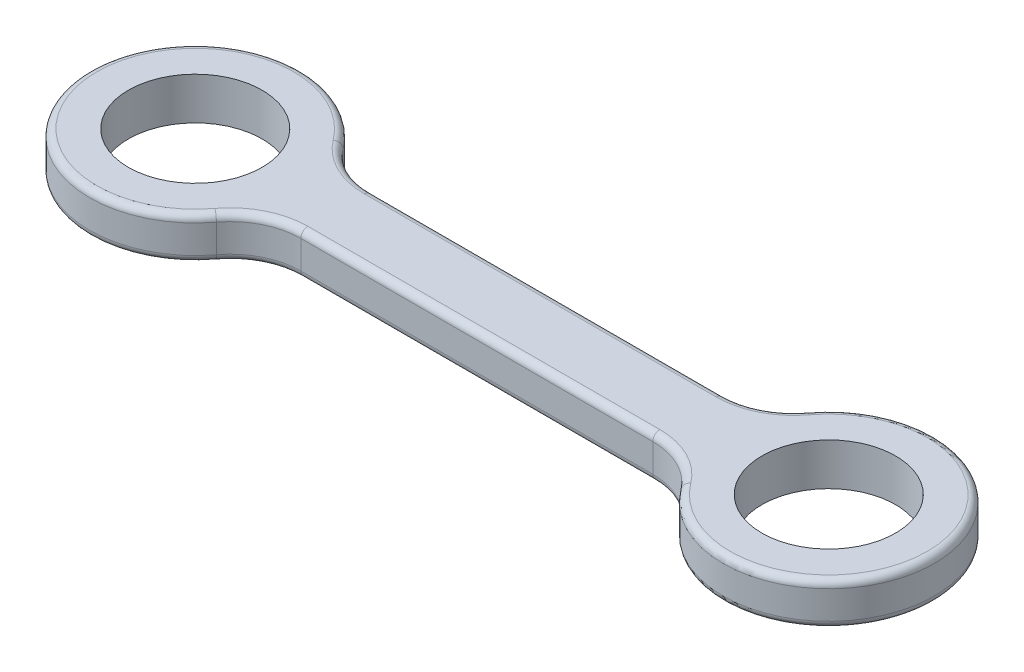
ISO-10303-21;
HEADER;
FILE_DESCRIPTION(('STEP AP214'),'2;1');
FILE_NAME('part.step','',(''),(''),'','','');
FILE_SCHEMA(('AUTOMOTIVE_DESIGN { 1 0 10303 214 1 1 1 1 }'));
ENDSEC;
DATA;
#1=APPLICATION_CONTEXT('core data for automotive mechanical design processes');
#2=APPLICATION_PROTOCOL_DEFINITION('international standard','automotive_design',2000,#1);
#3=PRODUCT_CONTEXT('',#1,'mechanical');
#4=PRODUCT('Part','Part','',(#3));
#5=PRODUCT_RELATED_PRODUCT_CATEGORY('part','',(#4));
#6=PRODUCT_DEFINITION_FORMATION('','',#4);
#7=PRODUCT_DEFINITION_CONTEXT('part definition',#1,'design');
#8=PRODUCT_DEFINITION('design','',#6,#7);
#9=PRODUCT_DEFINITION_SHAPE('','',#8);
#10=(LENGTH_UNIT() NAMED_UNIT(*) SI_UNIT(.MILLI.,.METRE.));
#11=(NAMED_UNIT(*) PLANE_ANGLE_UNIT() SI_UNIT($,.RADIAN.));
#12=(NAMED_UNIT(*) SI_UNIT($,.STERADIAN.) SOLID_ANGLE_UNIT());
#13=UNCERTAINTY_MEASURE_WITH_UNIT(LENGTH_MEASURE(1.E-05),#10,'distance_accuracy_value','');
#14=(GEOMETRIC_REPRESENTATION_CONTEXT(3) GLOBAL_UNCERTAINTY_ASSIGNED_CONTEXT((#13)) GLOBAL_UNIT_ASSIGNED_CONTEXT((#10,
#11,#12)) REPRESENTATION_CONTEXT('',''));
#15=CARTESIAN_POINT('',(0.,0.,0.));
#16=DIRECTION('',(0.,0.,1.));
#17=DIRECTION('',(1.,0.,0.));
#18=AXIS2_PLACEMENT_3D('',#15,#16,#17);
#19=CARTESIAN_POINT('',(21.9540229885058,6.,-15.));
#20=DIRECTION('',(0.,-1.,0.));
#21=DIRECTION('',(0.,0.,-1.));
#22=AXIS2_PLACEMENT_3D('',#19,#20,#21);
#23=PLANE('',#22);
#24=CARTESIAN_POINT('',(-48.0459770114942,6.,0.));
#25=DIRECTION('',(0.,-1.,0.));
#26=DIRECTION('',(0.,0.,-1.));
#27=AXIS2_PLACEMENT_3D('',#24,#25,#26);
#28=CIRCLE('',#27,14.);
#29=CARTESIAN_POINT('',(-36.8459770114942,6.,-8.4));
#30=VERTEX_POINT('',#29);
#31=CARTESIAN_POINT('',(-36.8459770114942,6.,8.4));
#32=VERTEX_POINT('',#31);
#33=EDGE_CURVE('E61',#30,#32,#28,.F.);
#34=ORIENTED_EDGE('',*,*,#33,.T.);
#35=CARTESIAN_POINT('',(-28.0459770114942,6.,15.));
#36=DIRECTION('',(0.,-1.,0.));
#37=DIRECTION('',(0.,0.,-1.));
#38=AXIS2_PLACEMENT_3D('',#35,#36,#37);
#39=CIRCLE('',#38,11.);
#40=CARTESIAN_POINT('',(-28.0459770114942,6.,4.));
#41=VERTEX_POINT('',#40);
#42=EDGE_CURVE('E163',#32,#41,#39,.T.);
#43=ORIENTED_EDGE('',*,*,#42,.T.);
#44=DIRECTION('',(1.,0.,0.));
#45=VECTOR('',#44,1.);
#46=CARTESIAN_POINT('',(21.9540229885058,6.,4.));
#47=LINE('',#46,#45);
#48=CARTESIAN_POINT('',(21.9540229885058,6.,4.));
#49=VERTEX_POINT('',#48);
#50=EDGE_CURVE('E273',#41,#49,#47,.T.);
#51=ORIENTED_EDGE('',*,*,#50,.T.);
#52=CARTESIAN_POINT('',(21.9540229885058,6.,15.));
#53=DIRECTION('',(0.,-1.,0.));
#54=DIRECTION('',(0.,0.,-1.));
#55=AXIS2_PLACEMENT_3D('',#52,#53,#54);
#56=CIRCLE('',#55,11.);
#57=CARTESIAN_POINT('',(30.7540229885058,6.,8.4));
#58=VERTEX_POINT('',#57);
#59=EDGE_CURVE('E276',#49,#58,#56,.T.);
#60=ORIENTED_EDGE('',*,*,#59,.T.);
#61=CARTESIAN_POINT('',(41.9540229885058,6.,0.));
#62=DIRECTION('',(0.,-1.,0.));
#63=DIRECTION('',(0.,0.,-1.));
#64=AXIS2_PLACEMENT_3D('',#61,#62,#63);
#65=CIRCLE('',#64,14.);
#66=CARTESIAN_POINT('',(30.7540229885058,6.,-8.4));
#67=VERTEX_POINT('',#66);
#68=EDGE_CURVE('E279',#58,#67,#65,.F.);
#69=ORIENTED_EDGE('',*,*,#68,.T.);
#70=CARTESIAN_POINT('',(21.9540229885058,6.,-15.));
#71=DIRECTION('',(0.,-1.,0.));
#72=DIRECTION('',(0.,0.,-1.));
#73=AXIS2_PLACEMENT_3D('',#70,#71,#72);
#74=CIRCLE('',#73,11.);
#75=CARTESIAN_POINT('',(21.9540229885058,6.,-4.));
#76=VERTEX_POINT('',#75);
#77=EDGE_CURVE('E282',#67,#76,#74,.T.);
#78=ORIENTED_EDGE('',*,*,#77,.T.);
#79=DIRECTION('',(-1.,0.,0.));
#80=VECTOR('',#79,1.);
#81=CARTESIAN_POINT('',(21.9540229885058,6.,-4.));
#82=LINE('',#81,#80);
#83=CARTESIAN_POINT('',(-28.0459770114942,6.,-4.));
#84=VERTEX_POINT('',#83);
#85=EDGE_CURVE('E285',#76,#84,#82,.T.);
#86=ORIENTED_EDGE('',*,*,#85,.T.);
#87=CARTESIAN_POINT('',(-28.0459770114942,6.,-15.));
#88=DIRECTION('',(0.,-1.,0.));
#89=DIRECTION('',(0.,0.,-1.));
#90=AXIS2_PLACEMENT_3D('',#87,#88,#89);
#91=CIRCLE('',#90,11.);
#92=EDGE_CURVE('E66',#84,#30,#91,.T.);
#93=ORIENTED_EDGE('',*,*,#92,.T.);
#94=EDGE_LOOP('',(#34,#43,#51,#60,#69,#78,#86,#93));
#95=FACE_BOUND('',#94,.T.);
#96=CARTESIAN_POINT('',(-48.0459770114942,6.,0.));
#97=DIRECTION('',(0.,1.,0.));
#98=DIRECTION('',(0.,0.,1.));
#99=AXIS2_PLACEMENT_3D('',#96,#97,#98);
#100=CIRCLE('',#99,9.5);
#101=CARTESIAN_POINT('',(-48.0459770114942,6.,9.5));
#102=VERTEX_POINT('',#101);
#103=EDGE_CURVE('E377',#102,#102,#100,.T.);
#104=ORIENTED_EDGE('',*,*,#103,.F.);
#105=EDGE_LOOP('',(#104));
#106=FACE_BOUND('',#105,.T.);
#107=CARTESIAN_POINT('',(41.9540229885058,6.,0.));
#108=DIRECTION('',(0.,1.,0.));
#109=DIRECTION('',(0.,0.,1.));
#110=AXIS2_PLACEMENT_3D('',#107,#108,#109);
#111=CIRCLE('',#110,9.49999999999999);
#112=CARTESIAN_POINT('',(41.9540229885058,6.,9.49999999999999));
#113=VERTEX_POINT('',#112);
#114=EDGE_CURVE('E457',#113,#113,#111,.T.);
#115=ORIENTED_EDGE('',*,*,#114,.F.);
#116=EDGE_LOOP('',(#115));
#117=FACE_BOUND('',#116,.T.);
#118=ADVANCED_FACE('F43',(#95,#106,#117),#23,.F.);
#119=CARTESIAN_POINT('',(21.9540229885058,0.,-15.));
#120=DIRECTION('',(0.,-1.,0.));
#121=DIRECTION('',(0.,0.,-1.));
#122=AXIS2_PLACEMENT_3D('',#119,#120,#121);
#123=PLANE('',#122);
#124=CARTESIAN_POINT('',(-28.0459770114942,0.,15.));
#125=DIRECTION('',(0.,-1.,0.));
#126=DIRECTION('',(0.,0.,-1.));
#127=AXIS2_PLACEMENT_3D('',#124,#125,#126);
#128=CIRCLE('',#127,11.);
#129=CARTESIAN_POINT('',(-28.0459770114942,0.,4.));
#130=VERTEX_POINT('',#129);
#131=CARTESIAN_POINT('',(-36.8459770114942,0.,8.4));
#132=VERTEX_POINT('',#131);
#133=EDGE_CURVE('E212',#130,#132,#128,.F.);
#134=ORIENTED_EDGE('',*,*,#133,.T.);
#135=CARTESIAN_POINT('',(-48.0459770114942,0.,0.));
#136=DIRECTION('',(0.,-1.,0.));
#137=DIRECTION('',(0.,0.,-1.));
#138=AXIS2_PLACEMENT_3D('',#135,#136,#137);
#139=CIRCLE('',#138,14.);
#140=CARTESIAN_POINT('',(-36.8459770114942,0.,-8.39999999999999));
#141=VERTEX_POINT('',#140);
#142=EDGE_CURVE('E233',#132,#141,#139,.T.);
#143=ORIENTED_EDGE('',*,*,#142,.T.);
#144=CARTESIAN_POINT('',(-28.0459770114942,0.,-15.));
#145=DIRECTION('',(0.,-1.,0.));
#146=DIRECTION('',(0.,0.,-1.));
#147=AXIS2_PLACEMENT_3D('',#144,#145,#146);
#148=CIRCLE('',#147,11.);
#149=CARTESIAN_POINT('',(-28.0459770114942,0.,-4.));
#150=VERTEX_POINT('',#149);
#151=EDGE_CURVE('E230',#141,#150,#148,.F.);
#152=ORIENTED_EDGE('',*,*,#151,.T.);
#153=DIRECTION('',(-1.,0.,0.));
#154=VECTOR('',#153,1.);
#155=CARTESIAN_POINT('',(21.9540229885057,0.,-4.));
#156=LINE('',#155,#154);
#157=CARTESIAN_POINT('',(21.9540229885058,0.,-4.));
#158=VERTEX_POINT('',#157);
#159=EDGE_CURVE('E227',#150,#158,#156,.F.);
#160=ORIENTED_EDGE('',*,*,#159,.T.);
#161=CARTESIAN_POINT('',(21.9540229885058,0.,-15.));
#162=DIRECTION('',(0.,-1.,0.));
#163=DIRECTION('',(0.,0.,-1.));
#164=AXIS2_PLACEMENT_3D('',#161,#162,#163);
#165=CIRCLE('',#164,11.);
#166=CARTESIAN_POINT('',(30.7540229885058,0.,-8.4));
#167=VERTEX_POINT('',#166);
#168=EDGE_CURVE('E224',#158,#167,#165,.F.);
#169=ORIENTED_EDGE('',*,*,#168,.T.);
#170=CARTESIAN_POINT('',(41.9540229885058,0.,0.));
#171=DIRECTION('',(0.,-1.,0.));
#172=DIRECTION('',(0.,0.,-1.));
#173=AXIS2_PLACEMENT_3D('',#170,#171,#172);
#174=CIRCLE('',#173,14.);
#175=CARTESIAN_POINT('',(30.7540229885058,0.,8.4));
#176=VERTEX_POINT('',#175);
#177=EDGE_CURVE('E221',#167,#176,#174,.T.);
#178=ORIENTED_EDGE('',*,*,#177,.T.);
#179=CARTESIAN_POINT('',(21.9540229885058,0.,15.));
#180=DIRECTION('',(0.,-1.,0.));
#181=DIRECTION('',(0.,0.,-1.));
#182=AXIS2_PLACEMENT_3D('',#179,#180,#181);
#183=CIRCLE('',#182,11.);
#184=CARTESIAN_POINT('',(21.9540229885058,0.,4.));
#185=VERTEX_POINT('',#184);
#186=EDGE_CURVE('E218',#176,#185,#183,.F.);
#187=ORIENTED_EDGE('',*,*,#186,.T.);
#188=DIRECTION('',(1.,0.,0.));
#189=VECTOR('',#188,1.);
#190=CARTESIAN_POINT('',(-28.0459770114942,0.,4.));
#191=LINE('',#190,#189);
#192=EDGE_CURVE('E215',#185,#130,#191,.F.);
#193=ORIENTED_EDGE('',*,*,#192,.T.);
#194=EDGE_LOOP('',(#134,#143,#152,#160,#169,#178,#187,#193));
#195=FACE_BOUND('',#194,.T.);
#196=CARTESIAN_POINT('',(-48.0459770114942,0.,0.));
#197=DIRECTION('',(0.,1.,0.));
#198=DIRECTION('',(0.,0.,1.));
#199=AXIS2_PLACEMENT_3D('',#196,#197,#198);
#200=CIRCLE('',#199,9.5);
#201=CARTESIAN_POINT('',(-48.0459770114942,0.,9.5));
#202=VERTEX_POINT('',#201);
#203=EDGE_CURVE('E385',#202,#202,#200,.T.);
#204=ORIENTED_EDGE('',*,*,#203,.T.);
#205=EDGE_LOOP('',(#204));
#206=FACE_BOUND('',#205,.T.);
#207=CARTESIAN_POINT('',(41.9540229885058,0.,0.));
#208=DIRECTION('',(0.,1.,0.));
#209=DIRECTION('',(0.,0.,1.));
#210=AXIS2_PLACEMENT_3D('',#207,#208,#209);
#211=CIRCLE('',#210,9.49999999999999);
#212=CARTESIAN_POINT('',(41.9540229885058,0.,9.49999999999999));
#213=VERTEX_POINT('',#212);
#214=EDGE_CURVE('E326',#213,#213,#211,.T.);
#215=ORIENTED_EDGE('',*,*,#214,.T.);
#216=EDGE_LOOP('',(#215));
#217=FACE_BOUND('',#216,.T.);
#218=ADVANCED_FACE('F411',(#195,#206,#217),#123,.T.);
#219=CARTESIAN_POINT('',(21.9540229885058,6.,-15.));
#220=DIRECTION('',(0.,-1.,0.));
#221=DIRECTION('',(0.,0.,-1.));
#222=AXIS2_PLACEMENT_3D('',#219,#220,#221);
#223=CYLINDRICAL_SURFACE('',#222,10.);
#224=DIRECTION('',(0.,-1.,0.));
#225=VECTOR('',#224,1.);
#226=CARTESIAN_POINT('',(29.9540229885058,6.,-9.));
#227=LINE('',#226,#225);
#228=CARTESIAN_POINT('',(29.9540229885058,5.,-9.));
#229=VERTEX_POINT('',#228);
#230=CARTESIAN_POINT('',(29.9540229885058,1.,-9.));
#231=VERTEX_POINT('',#230);
#232=EDGE_CURVE('E368',#229,#231,#227,.T.);
#233=ORIENTED_EDGE('',*,*,#232,.T.);
#234=CARTESIAN_POINT('',(21.9540229885058,1.,-15.));
#235=DIRECTION('',(0.,-1.,0.));
#236=DIRECTION('',(0.,0.,-1.));
#237=AXIS2_PLACEMENT_3D('',#234,#235,#236);
#238=CIRCLE('',#237,10.);
#239=CARTESIAN_POINT('',(21.9540229885058,1.,-5.));
#240=VERTEX_POINT('',#239);
#241=EDGE_CURVE('E252',#231,#240,#238,.T.);
#242=ORIENTED_EDGE('',*,*,#241,.T.);
#243=DIRECTION('',(0.,-1.,0.));
#244=VECTOR('',#243,1.);
#245=CARTESIAN_POINT('',(21.9540229885058,6.,-5.));
#246=LINE('',#245,#244);
#247=CARTESIAN_POINT('',(21.9540229885058,5.,-5.));
#248=VERTEX_POINT('',#247);
#249=EDGE_CURVE('E179',#248,#240,#246,.T.);
#250=ORIENTED_EDGE('',*,*,#249,.F.);
#251=CARTESIAN_POINT('',(21.9540229885058,5.,-15.));
#252=DIRECTION('',(0.,-1.,0.));
#253=DIRECTION('',(0.,0.,-1.));
#254=AXIS2_PLACEMENT_3D('',#251,#252,#253);
#255=CIRCLE('',#254,10.);
#256=EDGE_CURVE('E249',#248,#229,#255,.F.);
#257=ORIENTED_EDGE('',*,*,#256,.T.);
#258=EDGE_LOOP('',(#233,#242,#250,#257));
#259=FACE_BOUND('',#258,.T.);
#260=ADVANCED_FACE('F367',(#259),#223,.F.);
#261=CARTESIAN_POINT('',(-28.0459770114942,6.,-5.));
#262=DIRECTION('',(0.,0.,1.));
#263=DIRECTION('',(1.,0.,0.));
#264=AXIS2_PLACEMENT_3D('',#261,#262,#263);
#265=PLANE('',#264);
#266=ORIENTED_EDGE('',*,*,#249,.T.);
#267=DIRECTION('',(-1.,0.,0.));
#268=VECTOR('',#267,1.);
#269=CARTESIAN_POINT('',(-28.0459770114942,1.,-5.));
#270=LINE('',#269,#268);
#271=CARTESIAN_POINT('',(-28.0459770114942,1.,-4.99999999999999));
#272=VERTEX_POINT('',#271);
#273=EDGE_CURVE('E246',#240,#272,#270,.T.);
#274=ORIENTED_EDGE('',*,*,#273,.T.);
#275=DIRECTION('',(0.,-1.,0.));
#276=VECTOR('',#275,1.);
#277=CARTESIAN_POINT('',(-28.0459770114942,6.,-4.99999999999999));
#278=LINE('',#277,#276);
#279=CARTESIAN_POINT('',(-28.0459770114942,5.,-4.99999999999999));
#280=VERTEX_POINT('',#279);
#281=EDGE_CURVE('E198',#280,#272,#278,.T.);
#282=ORIENTED_EDGE('',*,*,#281,.F.);
#283=DIRECTION('',(-1.,0.,0.));
#284=VECTOR('',#283,1.);
#285=CARTESIAN_POINT('',(-28.0459770114942,5.,-5.));
#286=LINE('',#285,#284);
#287=EDGE_CURVE('E243',#280,#248,#286,.F.);
#288=ORIENTED_EDGE('',*,*,#287,.T.);
#289=EDGE_LOOP('',(#266,#274,#282,#288));
#290=FACE_BOUND('',#289,.T.);
#291=ADVANCED_FACE('F424',(#290),#265,.F.);
#292=CARTESIAN_POINT('',(-28.0459770114942,6.,-15.));
#293=DIRECTION('',(0.,-1.,0.));
#294=DIRECTION('',(0.,0.,-1.));
#295=AXIS2_PLACEMENT_3D('',#292,#293,#294);
#296=CYLINDRICAL_SURFACE('',#295,10.);
#297=ORIENTED_EDGE('',*,*,#281,.T.);
#298=CARTESIAN_POINT('',(-28.0459770114942,1.,-15.));
#299=DIRECTION('',(0.,-1.,0.));
#300=DIRECTION('',(0.,0.,-1.));
#301=AXIS2_PLACEMENT_3D('',#298,#299,#300);
#302=CIRCLE('',#301,10.);
#303=CARTESIAN_POINT('',(-36.0459770114942,1.,-9.));
#304=VERTEX_POINT('',#303);
#305=EDGE_CURVE('E240',#272,#304,#302,.T.);
#306=ORIENTED_EDGE('',*,*,#305,.T.);
#307=DIRECTION('',(0.,-1.,0.));
#308=VECTOR('',#307,1.);
#309=CARTESIAN_POINT('',(-36.0459770114942,6.,-9.));
#310=LINE('',#309,#308);
#311=CARTESIAN_POINT('',(-36.0459770114942,5.,-9.));
#312=VERTEX_POINT('',#311);
#313=EDGE_CURVE('E192',#312,#304,#310,.T.);
#314=ORIENTED_EDGE('',*,*,#313,.F.);
#315=CARTESIAN_POINT('',(-28.0459770114942,5.,-15.));
#316=DIRECTION('',(0.,-1.,0.));
#317=DIRECTION('',(0.,0.,-1.));
#318=AXIS2_PLACEMENT_3D('',#315,#316,#317);
#319=CIRCLE('',#318,10.);
#320=EDGE_CURVE('E237',#312,#280,#319,.F.);
#321=ORIENTED_EDGE('',*,*,#320,.T.);
#322=EDGE_LOOP('',(#297,#306,#314,#321));
#323=FACE_BOUND('',#322,.T.);
#324=ADVANCED_FACE('F428',(#323),#296,.F.);
#325=CARTESIAN_POINT('',(-48.0459770114942,6.,0.));
#326=DIRECTION('',(0.,-1.,0.));
#327=DIRECTION('',(0.,0.,-1.));
#328=AXIS2_PLACEMENT_3D('',#325,#326,#327);
#329=CYLINDRICAL_SURFACE('',#328,15.);
#330=ORIENTED_EDGE('',*,*,#313,.T.);
#331=CARTESIAN_POINT('',(-48.0459770114942,1.,0.));
#332=DIRECTION('',(0.,-1.,0.));
#333=DIRECTION('',(0.,0.,-1.));
#334=AXIS2_PLACEMENT_3D('',#331,#332,#333);
#335=CIRCLE('',#334,15.);
#336=CARTESIAN_POINT('',(-36.0459770114942,1.,9.));
#337=VERTEX_POINT('',#336);
#338=EDGE_CURVE('E178',#304,#337,#335,.F.);
#339=ORIENTED_EDGE('',*,*,#338,.T.);
#340=DIRECTION('',(0.,-1.,0.));
#341=VECTOR('',#340,1.);
#342=CARTESIAN_POINT('',(-36.0459770114942,6.,9.));
#343=LINE('',#342,#341);
#344=CARTESIAN_POINT('',(-36.0459770114942,5.,9.));
#345=VERTEX_POINT('',#344);
#346=EDGE_CURVE('E185',#345,#337,#343,.T.);
#347=ORIENTED_EDGE('',*,*,#346,.F.);
#348=CARTESIAN_POINT('',(-48.0459770114942,5.,0.));
#349=DIRECTION('',(0.,-1.,0.));
#350=DIRECTION('',(0.,0.,-1.));
#351=AXIS2_PLACEMENT_3D('',#348,#349,#350);
#352=CIRCLE('',#351,15.);
#353=EDGE_CURVE('E170',#345,#312,#352,.T.);
#354=ORIENTED_EDGE('',*,*,#353,.T.);
#355=EDGE_LOOP('',(#330,#339,#347,#354));
#356=FACE_BOUND('',#355,.T.);
#357=ADVANCED_FACE('F189',(#356),#329,.T.);
#358=CARTESIAN_POINT('',(-28.0459770114942,6.,15.));
#359=DIRECTION('',(0.,-1.,0.));
#360=DIRECTION('',(0.,0.,-1.));
#361=AXIS2_PLACEMENT_3D('',#358,#359,#360);
#362=CYLINDRICAL_SURFACE('',#361,10.);
#363=DIRECTION('',(0.,-1.,0.));
#364=VECTOR('',#363,1.);
#365=CARTESIAN_POINT('',(-28.0459770114942,6.,5.));
#366=LINE('',#365,#364);
#367=CARTESIAN_POINT('',(-28.0459770114942,5.,5.));
#368=VERTEX_POINT('',#367);
#369=CARTESIAN_POINT('',(-28.0459770114942,1.,5.));
#370=VERTEX_POINT('',#369);
#371=EDGE_CURVE('E187',#368,#370,#366,.T.);
#372=ORIENTED_EDGE('',*,*,#371,.F.);
#373=CARTESIAN_POINT('',(-28.0459770114942,5.,15.));
#374=DIRECTION('',(0.,-1.,0.));
#375=DIRECTION('',(0.,0.,-1.));
#376=AXIS2_PLACEMENT_3D('',#373,#374,#375);
#377=CIRCLE('',#376,10.);
#378=EDGE_CURVE('E11',#368,#345,#377,.F.);
#379=ORIENTED_EDGE('',*,*,#378,.T.);
#380=ORIENTED_EDGE('',*,*,#346,.T.);
#381=CARTESIAN_POINT('',(-28.0459770114942,1.,15.));
#382=DIRECTION('',(0.,-1.,0.));
#383=DIRECTION('',(0.,0.,-1.));
#384=AXIS2_PLACEMENT_3D('',#381,#382,#383);
#385=CIRCLE('',#384,10.);
#386=EDGE_CURVE('E53',#337,#370,#385,.T.);
#387=ORIENTED_EDGE('',*,*,#386,.T.);
#388=EDGE_LOOP('',(#372,#379,#380,#387));
#389=FACE_BOUND('',#388,.T.);
#390=ADVANCED_FACE('F184',(#389),#362,.F.);
#391=CARTESIAN_POINT('',(-28.0459770114942,6.,5.));
#392=DIRECTION('',(0.,0.,-1.));
#393=DIRECTION('',(-1.,0.,0.));
#394=AXIS2_PLACEMENT_3D('',#391,#392,#393);
#395=PLANE('',#394);
#396=ORIENTED_EDGE('',*,*,#371,.T.);
#397=DIRECTION('',(1.,0.,0.));
#398=VECTOR('',#397,1.);
#399=CARTESIAN_POINT('',(21.9540229885058,1.,5.));
#400=LINE('',#399,#398);
#401=CARTESIAN_POINT('',(21.9540229885058,1.,5.));
#402=VERTEX_POINT('',#401);
#403=EDGE_CURVE('E270',#370,#402,#400,.T.);
#404=ORIENTED_EDGE('',*,*,#403,.T.);
#405=DIRECTION('',(0.,-1.,0.));
#406=VECTOR('',#405,1.);
#407=CARTESIAN_POINT('',(21.9540229885058,6.,5.));
#408=LINE('',#407,#406);
#409=CARTESIAN_POINT('',(21.9540229885058,5.,5.));
#410=VERTEX_POINT('',#409);
#411=EDGE_CURVE('E200',#410,#402,#408,.T.);
#412=ORIENTED_EDGE('',*,*,#411,.F.);
#413=DIRECTION('',(1.,0.,0.));
#414=VECTOR('',#413,1.);
#415=CARTESIAN_POINT('',(-28.0459770114942,5.,5.));
#416=LINE('',#415,#414);
#417=EDGE_CURVE('E267',#410,#368,#416,.F.);
#418=ORIENTED_EDGE('',*,*,#417,.T.);
#419=EDGE_LOOP('',(#396,#404,#412,#418));
#420=FACE_BOUND('',#419,.T.);
#421=ADVANCED_FACE('F444',(#420),#395,.F.);
#422=CARTESIAN_POINT('',(21.9540229885058,6.,15.));
#423=DIRECTION('',(0.,-1.,0.));
#424=DIRECTION('',(0.,0.,-1.));
#425=AXIS2_PLACEMENT_3D('',#422,#423,#424);
#426=CYLINDRICAL_SURFACE('',#425,10.);
#427=ORIENTED_EDGE('',*,*,#411,.T.);
#428=CARTESIAN_POINT('',(21.9540229885058,1.,15.));
#429=DIRECTION('',(0.,-1.,0.));
#430=DIRECTION('',(0.,0.,-1.));
#431=AXIS2_PLACEMENT_3D('',#428,#429,#430);
#432=CIRCLE('',#431,10.);
#433=CARTESIAN_POINT('',(29.9540229885058,1.,8.99999999999999));
#434=VERTEX_POINT('',#433);
#435=EDGE_CURVE('E264',#402,#434,#432,.T.);
#436=ORIENTED_EDGE('',*,*,#435,.T.);
#437=DIRECTION('',(0.,-1.,0.));
#438=VECTOR('',#437,1.);
#439=CARTESIAN_POINT('',(29.9540229885058,6.,8.99999999999999));
#440=LINE('',#439,#438);
#441=CARTESIAN_POINT('',(29.9540229885058,5.,8.99999999999999));
#442=VERTEX_POINT('',#441);
#443=EDGE_CURVE('E376',#442,#434,#440,.T.);
#444=ORIENTED_EDGE('',*,*,#443,.F.);
#445=CARTESIAN_POINT('',(21.9540229885058,5.,15.));
#446=DIRECTION('',(0.,-1.,0.));
#447=DIRECTION('',(0.,0.,-1.));
#448=AXIS2_PLACEMENT_3D('',#445,#446,#447);
#449=CIRCLE('',#448,10.);
#450=EDGE_CURVE('E261',#442,#410,#449,.F.);
#451=ORIENTED_EDGE('',*,*,#450,.T.);
#452=EDGE_LOOP('',(#427,#436,#444,#451));
#453=FACE_BOUND('',#452,.T.);
#454=ADVANCED_FACE('F395',(#453),#426,.F.);
#455=CARTESIAN_POINT('',(41.9540229885058,6.,0.));
#456=DIRECTION('',(0.,-1.,0.));
#457=DIRECTION('',(0.,0.,-1.));
#458=AXIS2_PLACEMENT_3D('',#455,#456,#457);
#459=CYLINDRICAL_SURFACE('',#458,15.);
#460=ORIENTED_EDGE('',*,*,#443,.T.);
#461=CARTESIAN_POINT('',(41.9540229885058,1.,0.));
#462=DIRECTION('',(0.,-1.,0.));
#463=DIRECTION('',(0.,0.,-1.));
#464=AXIS2_PLACEMENT_3D('',#461,#462,#463);
#465=CIRCLE('',#464,15.);
#466=EDGE_CURVE('E258',#434,#231,#465,.F.);
#467=ORIENTED_EDGE('',*,*,#466,.T.);
#468=ORIENTED_EDGE('',*,*,#232,.F.);
#469=CARTESIAN_POINT('',(41.9540229885058,5.,0.));
#470=DIRECTION('',(0.,-1.,0.));
#471=DIRECTION('',(0.,0.,-1.));
#472=AXIS2_PLACEMENT_3D('',#469,#470,#471);
#473=CIRCLE('',#472,15.);
#474=EDGE_CURVE('E255',#229,#442,#473,.T.);
#475=ORIENTED_EDGE('',*,*,#474,.T.);
#476=EDGE_LOOP('',(#460,#467,#468,#475));
#477=FACE_BOUND('',#476,.T.);
#478=ADVANCED_FACE('F372',(#477),#459,.T.);
#479=CARTESIAN_POINT('',(-48.0459770114942,6.,0.));
#480=DIRECTION('',(0.,-1.,0.));
#481=DIRECTION('',(0.,0.,-1.));
#482=AXIS2_PLACEMENT_3D('',#479,#480,#481);
#483=CYLINDRICAL_SURFACE('',#482,9.5);
#484=ORIENTED_EDGE('',*,*,#103,.T.);
#485=EDGE_LOOP('',(#484));
#486=FACE_BOUND('',#485,.T.);
#487=ORIENTED_EDGE('',*,*,#203,.F.);
#488=EDGE_LOOP('',(#487));
#489=FACE_BOUND('',#488,.T.);
#490=ADVANCED_FACE('F475',(#486,#489),#483,.F.);
#491=CARTESIAN_POINT('',(41.9540229885058,6.,0.));
#492=DIRECTION('',(0.,-1.,0.));
#493=DIRECTION('',(0.,0.,-1.));
#494=AXIS2_PLACEMENT_3D('',#491,#492,#493);
#495=CYLINDRICAL_SURFACE('',#494,9.49999999999999);
#496=ORIENTED_EDGE('',*,*,#114,.T.);
#497=EDGE_LOOP('',(#496));
#498=FACE_BOUND('',#497,.T.);
#499=ORIENTED_EDGE('',*,*,#214,.F.);
#500=EDGE_LOOP('',(#499));
#501=FACE_BOUND('',#500,.T.);
#502=ADVANCED_FACE('F473',(#498,#501),#495,.F.);
#503=CARTESIAN_POINT('',(41.9540229885058,1.,0.));
#504=DIRECTION('',(0.,-1.,0.));
#505=DIRECTION('',(0.,0.,-1.));
#506=AXIS2_PLACEMENT_3D('',#503,#504,#505);
#507=TOROIDAL_SURFACE('',#506,14.,1.);
#508=CARTESIAN_POINT('',(30.7540229885058,1.,8.4));
#509=DIRECTION('',(-0.600000000000001,0.,-0.799999999999999));
#510=DIRECTION('',(-0.8,0.,0.600000000000001));
#511=AXIS2_PLACEMENT_3D('',#508,#509,#510);
#512=CIRCLE('',#511,1.);
#513=EDGE_CURVE('E318',#176,#434,#512,.T.);
#514=ORIENTED_EDGE('',*,*,#513,.F.);
#515=ORIENTED_EDGE('',*,*,#177,.F.);
#516=CARTESIAN_POINT('',(30.7540229885058,1.,-8.4));
#517=DIRECTION('',(-0.600000000000001,0.,0.799999999999999));
#518=DIRECTION('',(0.8,0.,0.600000000000001));
#519=AXIS2_PLACEMENT_3D('',#516,#517,#518);
#520=CIRCLE('',#519,1.);
#521=EDGE_CURVE('E322',#231,#167,#520,.T.);
#522=ORIENTED_EDGE('',*,*,#521,.F.);
#523=ORIENTED_EDGE('',*,*,#466,.F.);
#524=EDGE_LOOP('',(#514,#515,#522,#523));
#525=FACE_BOUND('',#524,.T.);
#526=ADVANCED_FACE('F417',(#525),#507,.T.);
#527=CARTESIAN_POINT('',(21.9540229885058,1.,-15.));
#528=DIRECTION('',(0.,-1.,0.));
#529=DIRECTION('',(0.,0.,-1.));
#530=AXIS2_PLACEMENT_3D('',#527,#528,#529);
#531=TOROIDAL_SURFACE('',#530,11.,1.);
#532=ORIENTED_EDGE('',*,*,#521,.T.);
#533=ORIENTED_EDGE('',*,*,#168,.F.);
#534=CARTESIAN_POINT('',(21.9540229885058,1.,-4.));
#535=DIRECTION('',(-1.,0.,0.));
#536=DIRECTION('',(0.,0.,1.));
#537=AXIS2_PLACEMENT_3D('',#534,#535,#536);
#538=CIRCLE('',#537,1.);
#539=EDGE_CURVE('E314',#240,#158,#538,.T.);
#540=ORIENTED_EDGE('',*,*,#539,.F.);
#541=ORIENTED_EDGE('',*,*,#241,.F.);
#542=EDGE_LOOP('',(#532,#533,#540,#541));
#543=FACE_BOUND('',#542,.T.);
#544=ADVANCED_FACE('F421',(#543),#531,.T.);
#545=CARTESIAN_POINT('',(21.9540229885058,1.,15.));
#546=DIRECTION('',(0.,-1.,0.));
#547=DIRECTION('',(0.,0.,-1.));
#548=AXIS2_PLACEMENT_3D('',#545,#546,#547);
#549=TOROIDAL_SURFACE('',#548,11.,1.);
#550=ORIENTED_EDGE('',*,*,#513,.T.);
#551=ORIENTED_EDGE('',*,*,#435,.F.);
#552=CARTESIAN_POINT('',(21.9540229885058,1.,4.));
#553=DIRECTION('',(-1.,0.,0.));
#554=DIRECTION('',(0.,0.,1.));
#555=AXIS2_PLACEMENT_3D('',#552,#553,#554);
#556=CIRCLE('',#555,1.);
#557=EDGE_CURVE('E310',#185,#402,#556,.T.);
#558=ORIENTED_EDGE('',*,*,#557,.F.);
#559=ORIENTED_EDGE('',*,*,#186,.F.);
#560=EDGE_LOOP('',(#550,#551,#558,#559));
#561=FACE_BOUND('',#560,.T.);
#562=ADVANCED_FACE('F401',(#561),#549,.T.);
#563=CARTESIAN_POINT('',(-28.0459770114942,1.,-4.));
#564=DIRECTION('',(1.,0.,0.));
#565=DIRECTION('',(0.,0.,-1.));
#566=AXIS2_PLACEMENT_3D('',#563,#564,#565);
#567=CYLINDRICAL_SURFACE('',#566,1.);
#568=ORIENTED_EDGE('',*,*,#539,.T.);
#569=ORIENTED_EDGE('',*,*,#159,.F.);
#570=CARTESIAN_POINT('',(-28.0459770114942,1.,-4.));
#571=DIRECTION('',(-1.,0.,0.));
#572=DIRECTION('',(0.,0.,1.));
#573=AXIS2_PLACEMENT_3D('',#570,#571,#572);
#574=CIRCLE('',#573,1.);
#575=EDGE_CURVE('E306',#272,#150,#574,.T.);
#576=ORIENTED_EDGE('',*,*,#575,.F.);
#577=ORIENTED_EDGE('',*,*,#273,.F.);
#578=EDGE_LOOP('',(#568,#569,#576,#577));
#579=FACE_BOUND('',#578,.T.);
#580=ADVANCED_FACE('F433',(#579),#567,.T.);
#581=CARTESIAN_POINT('',(-28.0459770114942,1.,4.));
#582=DIRECTION('',(-1.,0.,0.));
#583=DIRECTION('',(0.,0.,1.));
#584=AXIS2_PLACEMENT_3D('',#581,#582,#583);
#585=CYLINDRICAL_SURFACE('',#584,1.);
#586=ORIENTED_EDGE('',*,*,#557,.T.);
#587=ORIENTED_EDGE('',*,*,#403,.F.);
#588=CARTESIAN_POINT('',(-28.0459770114942,1.,4.));
#589=DIRECTION('',(-1.,0.,0.));
#590=DIRECTION('',(0.,0.,1.));
#591=AXIS2_PLACEMENT_3D('',#588,#589,#590);
#592=CIRCLE('',#591,1.);
#593=EDGE_CURVE('E302',#130,#370,#592,.T.);
#594=ORIENTED_EDGE('',*,*,#593,.F.);
#595=ORIENTED_EDGE('',*,*,#192,.F.);
#596=EDGE_LOOP('',(#586,#587,#594,#595));
#597=FACE_BOUND('',#596,.T.);
#598=ADVANCED_FACE('F407',(#597),#585,.T.);
#599=CARTESIAN_POINT('',(-28.0459770114942,1.,-15.));
#600=DIRECTION('',(0.,-1.,0.));
#601=DIRECTION('',(0.,0.,-1.));
#602=AXIS2_PLACEMENT_3D('',#599,#600,#601);
#603=TOROIDAL_SURFACE('',#602,11.,1.);
#604=ORIENTED_EDGE('',*,*,#575,.T.);
#605=ORIENTED_EDGE('',*,*,#151,.F.);
#606=CARTESIAN_POINT('',(-36.8459770114942,1.,-8.39999999999999));
#607=DIRECTION('',(-0.599999999999999,0.,-0.800000000000001));
#608=DIRECTION('',(-0.800000000000001,0.,0.599999999999999));
#609=AXIS2_PLACEMENT_3D('',#606,#607,#608);
#610=CIRCLE('',#609,1.);
#611=EDGE_CURVE('E299',#304,#141,#610,.T.);
#612=ORIENTED_EDGE('',*,*,#611,.F.);
#613=ORIENTED_EDGE('',*,*,#305,.F.);
#614=EDGE_LOOP('',(#604,#605,#612,#613));
#615=FACE_BOUND('',#614,.T.);
#616=ADVANCED_FACE('F437',(#615),#603,.T.);
#617=CARTESIAN_POINT('',(-28.0459770114942,1.,15.));
#618=DIRECTION('',(0.,-1.,0.));
#619=DIRECTION('',(0.,0.,-1.));
#620=AXIS2_PLACEMENT_3D('',#617,#618,#619);
#621=TOROIDAL_SURFACE('',#620,11.,1.);
#622=ORIENTED_EDGE('',*,*,#593,.T.);
#623=ORIENTED_EDGE('',*,*,#386,.F.);
#624=CARTESIAN_POINT('',(-36.8459770114942,1.,8.4));
#625=DIRECTION('',(-0.599999999999998,0.,0.800000000000002));
#626=DIRECTION('',(0.800000000000002,0.,0.599999999999998));
#627=AXIS2_PLACEMENT_3D('',#624,#625,#626);
#628=CIRCLE('',#627,1.);
#629=EDGE_CURVE('E296',#132,#337,#628,.T.);
#630=ORIENTED_EDGE('',*,*,#629,.F.);
#631=ORIENTED_EDGE('',*,*,#133,.F.);
#632=EDGE_LOOP('',(#622,#623,#630,#631));
#633=FACE_BOUND('',#632,.T.);
#634=ADVANCED_FACE('F443',(#633),#621,.T.);
#635=CARTESIAN_POINT('',(-48.0459770114942,1.,0.));
#636=DIRECTION('',(0.,-1.,0.));
#637=DIRECTION('',(0.,0.,-1.));
#638=AXIS2_PLACEMENT_3D('',#635,#636,#637);
#639=TOROIDAL_SURFACE('',#638,14.,1.);
#640=ORIENTED_EDGE('',*,*,#611,.T.);
#641=ORIENTED_EDGE('',*,*,#142,.F.);
#642=ORIENTED_EDGE('',*,*,#629,.T.);
#643=ORIENTED_EDGE('',*,*,#338,.F.);
#644=EDGE_LOOP('',(#640,#641,#642,#643));
#645=FACE_BOUND('',#644,.T.);
#646=ADVANCED_FACE('F439',(#645),#639,.T.);
#647=CARTESIAN_POINT('',(21.9540229885058,5.,-15.));
#648=DIRECTION('',(0.,-1.,0.));
#649=DIRECTION('',(0.,0.,-1.));
#650=AXIS2_PLACEMENT_3D('',#647,#648,#649);
#651=TOROIDAL_SURFACE('',#650,11.,1.);
#652=CARTESIAN_POINT('',(30.7540229885058,5.,-8.4));
#653=DIRECTION('',(0.600000000000001,0.,-0.799999999999999));
#654=DIRECTION('',(-0.8,0.,-0.600000000000001));
#655=AXIS2_PLACEMENT_3D('',#652,#653,#654);
#656=CIRCLE('',#655,1.);
#657=EDGE_CURVE('E341',#229,#67,#656,.T.);
#658=ORIENTED_EDGE('',*,*,#657,.F.);
#659=ORIENTED_EDGE('',*,*,#256,.F.);
#660=CARTESIAN_POINT('',(21.9540229885058,5.,-4.));
#661=DIRECTION('',(-1.,0.,0.));
#662=DIRECTION('',(0.,0.,1.));
#663=AXIS2_PLACEMENT_3D('',#660,#661,#662);
#664=CIRCLE('',#663,1.);
#665=EDGE_CURVE('E47',#76,#248,#664,.T.);
#666=ORIENTED_EDGE('',*,*,#665,.F.);
#667=ORIENTED_EDGE('',*,*,#77,.F.);
#668=EDGE_LOOP('',(#658,#659,#666,#667));
#669=FACE_BOUND('',#668,.T.);
#670=ADVANCED_FACE('F45',(#669),#651,.T.);
#671=CARTESIAN_POINT('',(21.9540229885058,5.,-4.));
#672=DIRECTION('',(-1.,0.,0.));
#673=DIRECTION('',(0.,0.,1.));
#674=AXIS2_PLACEMENT_3D('',#671,#672,#673);
#675=CYLINDRICAL_SURFACE('',#674,1.);
#676=ORIENTED_EDGE('',*,*,#665,.T.);
#677=ORIENTED_EDGE('',*,*,#287,.F.);
#678=CARTESIAN_POINT('',(-28.0459770114942,5.,-4.));
#679=DIRECTION('',(-1.,0.,0.));
#680=DIRECTION('',(0.,0.,1.));
#681=AXIS2_PLACEMENT_3D('',#678,#679,#680);
#682=CIRCLE('',#681,1.);
#683=EDGE_CURVE('E338',#84,#280,#682,.T.);
#684=ORIENTED_EDGE('',*,*,#683,.F.);
#685=ORIENTED_EDGE('',*,*,#85,.F.);
#686=EDGE_LOOP('',(#676,#677,#684,#685));
#687=FACE_BOUND('',#686,.T.);
#688=ADVANCED_FACE('F358',(#687),#675,.T.);
#689=CARTESIAN_POINT('',(41.9540229885058,5.,0.));
#690=DIRECTION('',(0.,-1.,0.));
#691=DIRECTION('',(0.,0.,-1.));
#692=AXIS2_PLACEMENT_3D('',#689,#690,#691);
#693=TOROIDAL_SURFACE('',#692,14.,1.);
#694=ORIENTED_EDGE('',*,*,#657,.T.);
#695=ORIENTED_EDGE('',*,*,#68,.F.);
#696=CARTESIAN_POINT('',(30.7540229885058,5.,8.4));
#697=DIRECTION('',(-0.600000000000001,0.,-0.799999999999999));
#698=DIRECTION('',(-0.8,0.,0.600000000000001));
#699=AXIS2_PLACEMENT_3D('',#696,#697,#698);
#700=CIRCLE('',#699,1.);
#701=EDGE_CURVE('E334',#442,#58,#700,.T.);
#702=ORIENTED_EDGE('',*,*,#701,.F.);
#703=ORIENTED_EDGE('',*,*,#474,.F.);
#704=EDGE_LOOP('',(#694,#695,#702,#703));
#705=FACE_BOUND('',#704,.T.);
#706=ADVANCED_FACE('F530',(#705),#693,.T.);
#707=CARTESIAN_POINT('',(-28.0459770114942,5.,-15.));
#708=DIRECTION('',(0.,-1.,0.));
#709=DIRECTION('',(0.,0.,-1.));
#710=AXIS2_PLACEMENT_3D('',#707,#708,#709);
#711=TOROIDAL_SURFACE('',#710,11.,1.);
#712=ORIENTED_EDGE('',*,*,#683,.T.);
#713=ORIENTED_EDGE('',*,*,#320,.F.);
#714=CARTESIAN_POINT('',(-36.8459770114942,5.,-8.4));
#715=DIRECTION('',(-0.599999999999998,0.,-0.800000000000002));
#716=DIRECTION('',(-0.800000000000002,0.,0.599999999999998));
#717=AXIS2_PLACEMENT_3D('',#714,#715,#716);
#718=CIRCLE('',#717,1.);
#719=EDGE_CURVE('E172',#30,#312,#718,.T.);
#720=ORIENTED_EDGE('',*,*,#719,.F.);
#721=ORIENTED_EDGE('',*,*,#92,.F.);
#722=EDGE_LOOP('',(#712,#713,#720,#721));
#723=FACE_BOUND('',#722,.T.);
#724=ADVANCED_FACE('F526',(#723),#711,.T.);
#725=CARTESIAN_POINT('',(21.9540229885058,5.,15.));
#726=DIRECTION('',(0.,-1.,0.));
#727=DIRECTION('',(0.,0.,-1.));
#728=AXIS2_PLACEMENT_3D('',#725,#726,#727);
#729=TOROIDAL_SURFACE('',#728,11.,1.);
#730=ORIENTED_EDGE('',*,*,#701,.T.);
#731=ORIENTED_EDGE('',*,*,#59,.F.);
#732=CARTESIAN_POINT('',(21.9540229885058,5.,4.));
#733=DIRECTION('',(-1.,0.,0.));
#734=DIRECTION('',(0.,0.,1.));
#735=AXIS2_PLACEMENT_3D('',#732,#733,#734);
#736=CIRCLE('',#735,1.);
#737=EDGE_CURVE('E166',#410,#49,#736,.T.);
#738=ORIENTED_EDGE('',*,*,#737,.F.);
#739=ORIENTED_EDGE('',*,*,#450,.F.);
#740=EDGE_LOOP('',(#730,#731,#738,#739));
#741=FACE_BOUND('',#740,.T.);
#742=ADVANCED_FACE('F523',(#741),#729,.T.);
#743=CARTESIAN_POINT('',(-48.0459770114942,5.,0.));
#744=DIRECTION('',(0.,-1.,0.));
#745=DIRECTION('',(0.,0.,-1.));
#746=AXIS2_PLACEMENT_3D('',#743,#744,#745);
#747=TOROIDAL_SURFACE('',#746,14.,1.);
#748=ORIENTED_EDGE('',*,*,#719,.T.);
#749=ORIENTED_EDGE('',*,*,#353,.F.);
#750=CARTESIAN_POINT('',(-36.8459770114942,5.,8.4));
#751=DIRECTION('',(0.600000000000001,0.,-0.799999999999999));
#752=DIRECTION('',(-0.799999999999999,0.,-0.600000000000001));
#753=AXIS2_PLACEMENT_3D('',#750,#751,#752);
#754=CIRCLE('',#753,1.);
#755=EDGE_CURVE('E159',#32,#345,#754,.T.);
#756=ORIENTED_EDGE('',*,*,#755,.F.);
#757=ORIENTED_EDGE('',*,*,#33,.F.);
#758=EDGE_LOOP('',(#748,#749,#756,#757));
#759=FACE_BOUND('',#758,.T.);
#760=ADVANCED_FACE('F171',(#759),#747,.T.);
#761=CARTESIAN_POINT('',(21.9540229885058,5.,4.));
#762=DIRECTION('',(1.,0.,0.));
#763=DIRECTION('',(0.,0.,-1.));
#764=AXIS2_PLACEMENT_3D('',#761,#762,#763);
#765=CYLINDRICAL_SURFACE('',#764,1.);
#766=ORIENTED_EDGE('',*,*,#737,.T.);
#767=ORIENTED_EDGE('',*,*,#50,.F.);
#768=CARTESIAN_POINT('',(-28.0459770114942,5.,4.));
#769=DIRECTION('',(-1.,0.,0.));
#770=DIRECTION('',(0.,0.,1.));
#771=AXIS2_PLACEMENT_3D('',#768,#769,#770);
#772=CIRCLE('',#771,1.);
#773=EDGE_CURVE('E167',#368,#41,#772,.T.);
#774=ORIENTED_EDGE('',*,*,#773,.F.);
#775=ORIENTED_EDGE('',*,*,#417,.F.);
#776=EDGE_LOOP('',(#766,#767,#774,#775));
#777=FACE_BOUND('',#776,.T.);
#778=ADVANCED_FACE('F447',(#777),#765,.T.);
#779=CARTESIAN_POINT('',(-28.0459770114942,5.,15.));
#780=DIRECTION('',(0.,-1.,0.));
#781=DIRECTION('',(0.,0.,-1.));
#782=AXIS2_PLACEMENT_3D('',#779,#780,#781);
#783=TOROIDAL_SURFACE('',#782,11.,1.);
#784=ORIENTED_EDGE('',*,*,#755,.T.);
#785=ORIENTED_EDGE('',*,*,#378,.F.);
#786=ORIENTED_EDGE('',*,*,#773,.T.);
#787=ORIENTED_EDGE('',*,*,#42,.F.);
#788=EDGE_LOOP('',(#784,#785,#786,#787));
#789=FACE_BOUND('',#788,.T.);
#790=ADVANCED_FACE('F161',(#789),#783,.T.);
#791=CLOSED_SHELL('',(#118,#218,#260,#291,#324,#357,#390,#421,#454,#478,#490,#502,#526,#544,
#562,#580,#598,#616,#634,#646,#670,#688,#706,#724,#742,#760,#778,#790));
#792=MANIFOLD_SOLID_BREP('B2',#791);
#793=ADVANCED_BREP_SHAPE_REPRESENTATION('',(#18,#792),#14);
#794=SHAPE_DEFINITION_REPRESENTATION(#9,#793);
ENDSEC;
END-ISO-10303-21;
